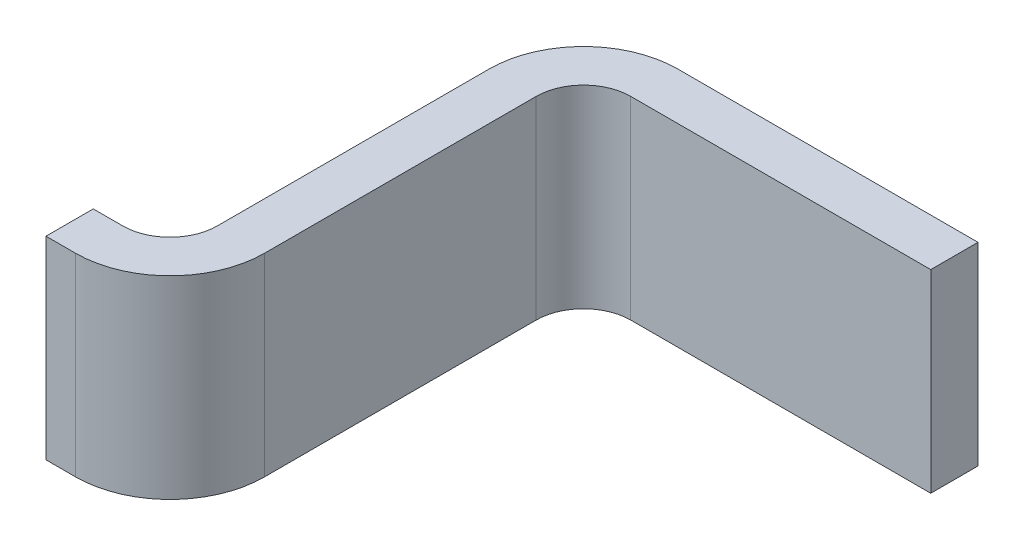
ISO-10303-21;
HEADER;
FILE_DESCRIPTION(('STEP AP214'),'2;1');
FILE_NAME('part.step','',(''),(''),'','','');
FILE_SCHEMA(('AUTOMOTIVE_DESIGN { 1 0 10303 214 1 1 1 1 }'));
ENDSEC;
DATA;
#1=APPLICATION_CONTEXT('core data for automotive mechanical design processes');
#2=APPLICATION_PROTOCOL_DEFINITION('international standard','automotive_design',2000,#1);
#3=PRODUCT_CONTEXT('',#1,'mechanical');
#4=PRODUCT('Part','Part','',(#3));
#5=PRODUCT_RELATED_PRODUCT_CATEGORY('part','',(#4));
#6=PRODUCT_DEFINITION_FORMATION('','',#4);
#7=PRODUCT_DEFINITION_CONTEXT('part definition',#1,'design');
#8=PRODUCT_DEFINITION('design','',#6,#7);
#9=PRODUCT_DEFINITION_SHAPE('','',#8);
#10=(LENGTH_UNIT() NAMED_UNIT(*) SI_UNIT(.MILLI.,.METRE.));
#11=(NAMED_UNIT(*) PLANE_ANGLE_UNIT() SI_UNIT($,.RADIAN.));
#12=(NAMED_UNIT(*) SI_UNIT($,.STERADIAN.) SOLID_ANGLE_UNIT());
#13=UNCERTAINTY_MEASURE_WITH_UNIT(LENGTH_MEASURE(1.E-05),#10,'distance_accuracy_value','');
#14=(GEOMETRIC_REPRESENTATION_CONTEXT(3) GLOBAL_UNCERTAINTY_ASSIGNED_CONTEXT((#13)) GLOBAL_UNIT_ASSIGNED_CONTEXT((#10,
#11,#12)) REPRESENTATION_CONTEXT('',''));
#15=CARTESIAN_POINT('',(0.,0.,0.));
#16=DIRECTION('',(0.,0.,1.));
#17=DIRECTION('',(1.,0.,0.));
#18=AXIS2_PLACEMENT_3D('',#15,#16,#17);
#19=CARTESIAN_POINT('',(0.,0.205,0.975));
#20=DIRECTION('',(0.,0.,-1.));
#21=DIRECTION('',(-1.,0.,0.));
#22=AXIS2_PLACEMENT_3D('',#19,#20,#21);
#23=PLANE('',#22);
#24=DIRECTION('',(1.,0.,0.));
#25=VECTOR('',#24,1.);
#26=CARTESIAN_POINT('',(0.,0.205,0.975));
#27=LINE('',#26,#25);
#28=CARTESIAN_POINT('',(0.0625,0.205,0.975));
#29=VERTEX_POINT('',#28);
#30=CARTESIAN_POINT('',(0.,0.205,0.975));
#31=VERTEX_POINT('',#30);
#32=EDGE_CURVE('E104',#29,#31,#27,.F.);
#33=ORIENTED_EDGE('',*,*,#32,.T.);
#34=DIRECTION('',(0.,1.,0.));
#35=VECTOR('',#34,1.);
#36=CARTESIAN_POINT('',(0.,-0.205,0.975));
#37=LINE('',#36,#35);
#38=CARTESIAN_POINT('',(0.,-0.205,0.975));
#39=VERTEX_POINT('',#38);
#40=EDGE_CURVE('E113',#39,#31,#37,.T.);
#41=ORIENTED_EDGE('',*,*,#40,.F.);
#42=DIRECTION('',(1.,0.,0.));
#43=VECTOR('',#42,1.);
#44=CARTESIAN_POINT('',(0.,-0.205,0.975));
#45=LINE('',#44,#43);
#46=CARTESIAN_POINT('',(0.0625,-0.205,0.975));
#47=VERTEX_POINT('',#46);
#48=EDGE_CURVE('E118',#39,#47,#45,.T.);
#49=ORIENTED_EDGE('',*,*,#48,.T.);
#50=DIRECTION('',(0.,1.,0.));
#51=VECTOR('',#50,1.);
#52=CARTESIAN_POINT('',(0.0625,0.205,0.975));
#53=LINE('',#52,#51);
#54=EDGE_CURVE('E116',#29,#47,#53,.F.);
#55=ORIENTED_EDGE('',*,*,#54,.F.);
#56=EDGE_LOOP('',(#33,#41,#49,#55));
#57=FACE_BOUND('',#56,.T.);
#58=ADVANCED_FACE('F17',(#57),#23,.F.);
#59=CARTESIAN_POINT('',(0.,-0.205,0.875));
#60=DIRECTION('',(-1.,0.,0.));
#61=DIRECTION('',(0.,0.,1.));
#62=AXIS2_PLACEMENT_3D('',#59,#60,#61);
#63=PLANE('',#62);
#64=DIRECTION('',(0.,0.,1.));
#65=VECTOR('',#64,1.);
#66=CARTESIAN_POINT('',(0.,0.205,0.875));
#67=LINE('',#66,#65);
#68=CARTESIAN_POINT('',(0.,0.205,0.875));
#69=VERTEX_POINT('',#68);
#70=EDGE_CURVE('E111',#31,#69,#67,.F.);
#71=ORIENTED_EDGE('',*,*,#70,.T.);
#72=DIRECTION('',(0.,1.,0.));
#73=VECTOR('',#72,1.);
#74=CARTESIAN_POINT('',(0.,-0.205,0.875));
#75=LINE('',#74,#73);
#76=CARTESIAN_POINT('',(0.,-0.205,0.875));
#77=VERTEX_POINT('',#76);
#78=EDGE_CURVE('E127',#69,#77,#75,.F.);
#79=ORIENTED_EDGE('',*,*,#78,.T.);
#80=DIRECTION('',(0.,0.,1.));
#81=VECTOR('',#80,1.);
#82=CARTESIAN_POINT('',(0.,-0.205,0.975));
#83=LINE('',#82,#81);
#84=EDGE_CURVE('E140',#77,#39,#83,.T.);
#85=ORIENTED_EDGE('',*,*,#84,.T.);
#86=ORIENTED_EDGE('',*,*,#40,.T.);
#87=EDGE_LOOP('',(#71,#79,#85,#86));
#88=FACE_BOUND('',#87,.T.);
#89=ADVANCED_FACE('F277',(#88),#63,.T.);
#90=CARTESIAN_POINT('',(0.0625,0.205,0.775));
#91=DIRECTION('',(0.,1.,0.));
#92=DIRECTION('',(0.,0.,1.));
#93=AXIS2_PLACEMENT_3D('',#90,#91,#92);
#94=CYLINDRICAL_SURFACE('',#93,0.2);
#95=CARTESIAN_POINT('',(0.0625,0.205,0.775));
#96=DIRECTION('',(0.,1.,0.));
#97=DIRECTION('',(0.,0.,1.));
#98=AXIS2_PLACEMENT_3D('',#95,#96,#97);
#99=CIRCLE('',#98,0.2);
#100=CARTESIAN_POINT('',(0.2625,0.205,0.775));
#101=VERTEX_POINT('',#100);
#102=EDGE_CURVE('E20',#29,#101,#99,.T.);
#103=ORIENTED_EDGE('',*,*,#102,.F.);
#104=ORIENTED_EDGE('',*,*,#54,.T.);
#105=CARTESIAN_POINT('',(0.0625,-0.205,0.775));
#106=DIRECTION('',(0.,1.,0.));
#107=DIRECTION('',(0.,0.,1.));
#108=AXIS2_PLACEMENT_3D('',#105,#106,#107);
#109=CIRCLE('',#108,0.2);
#110=CARTESIAN_POINT('',(0.2625,-0.205,0.775));
#111=VERTEX_POINT('',#110);
#112=EDGE_CURVE('E178',#111,#47,#109,.F.);
#113=ORIENTED_EDGE('',*,*,#112,.F.);
#114=DIRECTION('',(0.,1.,0.));
#115=VECTOR('',#114,1.);
#116=CARTESIAN_POINT('',(0.2625,0.205,0.775));
#117=LINE('',#116,#115);
#118=EDGE_CURVE('E124',#111,#101,#117,.T.);
#119=ORIENTED_EDGE('',*,*,#118,.T.);
#120=EDGE_LOOP('',(#103,#104,#113,#119));
#121=FACE_BOUND('',#120,.T.);
#122=ADVANCED_FACE('F123',(#121),#94,.T.);
#123=CARTESIAN_POINT('',(0.,-0.205,0.875));
#124=DIRECTION('',(0.,0.,1.));
#125=DIRECTION('',(1.,0.,0.));
#126=AXIS2_PLACEMENT_3D('',#123,#124,#125);
#127=PLANE('',#126);
#128=DIRECTION('',(1.,0.,0.));
#129=VECTOR('',#128,1.);
#130=CARTESIAN_POINT('',(0.,-0.205,0.875));
#131=LINE('',#130,#129);
#132=CARTESIAN_POINT('',(0.0625,-0.205,0.875));
#133=VERTEX_POINT('',#132);
#134=EDGE_CURVE('E131',#77,#133,#131,.T.);
#135=ORIENTED_EDGE('',*,*,#134,.F.);
#136=ORIENTED_EDGE('',*,*,#78,.F.);
#137=DIRECTION('',(1.,0.,0.));
#138=VECTOR('',#137,1.);
#139=CARTESIAN_POINT('',(0.,0.205,0.875));
#140=LINE('',#139,#138);
#141=CARTESIAN_POINT('',(0.0625,0.205,0.875));
#142=VERTEX_POINT('',#141);
#143=EDGE_CURVE('E126',#142,#69,#140,.F.);
#144=ORIENTED_EDGE('',*,*,#143,.F.);
#145=DIRECTION('',(0.,1.,0.));
#146=VECTOR('',#145,1.);
#147=CARTESIAN_POINT('',(0.0625,-0.205,0.875));
#148=LINE('',#147,#146);
#149=EDGE_CURVE('E175',#142,#133,#148,.F.);
#150=ORIENTED_EDGE('',*,*,#149,.T.);
#151=EDGE_LOOP('',(#135,#136,#144,#150));
#152=FACE_BOUND('',#151,.T.);
#153=ADVANCED_FACE('F271',(#152),#127,.F.);
#154=CARTESIAN_POINT('',(0.2625,0.205,0.775));
#155=DIRECTION('',(-1.,0.,0.));
#156=DIRECTION('',(0.,0.,1.));
#157=AXIS2_PLACEMENT_3D('',#154,#155,#156);
#158=PLANE('',#157);
#159=DIRECTION('',(0.,0.,-1.));
#160=VECTOR('',#159,1.);
#161=CARTESIAN_POINT('',(0.2625,0.205,0.775));
#162=LINE('',#161,#160);
#163=CARTESIAN_POINT('',(0.2625,0.205,0.2));
#164=VERTEX_POINT('',#163);
#165=EDGE_CURVE('E177',#164,#101,#162,.F.);
#166=ORIENTED_EDGE('',*,*,#165,.T.);
#167=ORIENTED_EDGE('',*,*,#118,.F.);
#168=DIRECTION('',(0.,0.,1.));
#169=VECTOR('',#168,1.);
#170=CARTESIAN_POINT('',(0.2625,-0.205,0.775));
#171=LINE('',#170,#169);
#172=CARTESIAN_POINT('',(0.2625,-0.205,0.2));
#173=VERTEX_POINT('',#172);
#174=EDGE_CURVE('E174',#111,#173,#171,.F.);
#175=ORIENTED_EDGE('',*,*,#174,.T.);
#176=DIRECTION('',(0.,-1.,0.));
#177=VECTOR('',#176,1.);
#178=CARTESIAN_POINT('',(0.2625,0.205,0.2));
#179=LINE('',#178,#177);
#180=EDGE_CURVE('E171',#173,#164,#179,.F.);
#181=ORIENTED_EDGE('',*,*,#180,.T.);
#182=EDGE_LOOP('',(#166,#167,#175,#181));
#183=FACE_BOUND('',#182,.T.);
#184=ADVANCED_FACE('F267',(#183),#158,.F.);
#185=CARTESIAN_POINT('',(0.0625,-0.205,0.775));
#186=DIRECTION('',(0.,1.,0.));
#187=DIRECTION('',(0.,0.,1.));
#188=AXIS2_PLACEMENT_3D('',#185,#186,#187);
#189=CYLINDRICAL_SURFACE('',#188,0.1);
#190=CARTESIAN_POINT('',(0.0625,-0.205,0.775));
#191=DIRECTION('',(0.,1.,0.));
#192=DIRECTION('',(0.,0.,1.));
#193=AXIS2_PLACEMENT_3D('',#190,#191,#192);
#194=CIRCLE('',#193,0.1);
#195=CARTESIAN_POINT('',(0.1625,-0.205,0.775));
#196=VERTEX_POINT('',#195);
#197=EDGE_CURVE('E172',#133,#196,#194,.T.);
#198=ORIENTED_EDGE('',*,*,#197,.F.);
#199=ORIENTED_EDGE('',*,*,#149,.F.);
#200=CARTESIAN_POINT('',(0.0625,0.205,0.775));
#201=DIRECTION('',(0.,1.,0.));
#202=DIRECTION('',(0.,0.,1.));
#203=AXIS2_PLACEMENT_3D('',#200,#201,#202);
#204=CIRCLE('',#203,0.1);
#205=CARTESIAN_POINT('',(0.1625,0.205,0.775));
#206=VERTEX_POINT('',#205);
#207=EDGE_CURVE('E176',#206,#142,#204,.F.);
#208=ORIENTED_EDGE('',*,*,#207,.F.);
#209=DIRECTION('',(0.,1.,0.));
#210=VECTOR('',#209,1.);
#211=CARTESIAN_POINT('',(0.1625,-0.205,0.775));
#212=LINE('',#211,#210);
#213=EDGE_CURVE('E188',#206,#196,#212,.F.);
#214=ORIENTED_EDGE('',*,*,#213,.T.);
#215=EDGE_LOOP('',(#198,#199,#208,#214));
#216=FACE_BOUND('',#215,.T.);
#217=ADVANCED_FACE('F263',(#216),#189,.F.);
#218=CARTESIAN_POINT('',(0.3625,0.205,0.2));
#219=DIRECTION('',(0.,-1.,0.));
#220=DIRECTION('',(0.,0.,-1.));
#221=AXIS2_PLACEMENT_3D('',#218,#219,#220);
#222=CYLINDRICAL_SURFACE('',#221,0.1);
#223=CARTESIAN_POINT('',(0.3625,0.205,0.2));
#224=DIRECTION('',(0.,-1.,0.));
#225=DIRECTION('',(0.,0.,-1.));
#226=AXIS2_PLACEMENT_3D('',#223,#224,#225);
#227=CIRCLE('',#226,0.1);
#228=CARTESIAN_POINT('',(0.3625,0.205,0.1));
#229=VERTEX_POINT('',#228);
#230=EDGE_CURVE('E168',#164,#229,#227,.T.);
#231=ORIENTED_EDGE('',*,*,#230,.F.);
#232=ORIENTED_EDGE('',*,*,#180,.F.);
#233=CARTESIAN_POINT('',(0.3625,-0.205,0.2));
#234=DIRECTION('',(0.,-1.,0.));
#235=DIRECTION('',(0.,0.,-1.));
#236=AXIS2_PLACEMENT_3D('',#233,#234,#235);
#237=CIRCLE('',#236,0.1);
#238=CARTESIAN_POINT('',(0.3625,-0.205,0.1));
#239=VERTEX_POINT('',#238);
#240=EDGE_CURVE('E163',#239,#173,#237,.F.);
#241=ORIENTED_EDGE('',*,*,#240,.F.);
#242=DIRECTION('',(0.,1.,0.));
#243=VECTOR('',#242,1.);
#244=CARTESIAN_POINT('',(0.3625,0.205,0.1));
#245=LINE('',#244,#243);
#246=EDGE_CURVE('E166',#239,#229,#245,.T.);
#247=ORIENTED_EDGE('',*,*,#246,.T.);
#248=EDGE_LOOP('',(#231,#232,#241,#247));
#249=FACE_BOUND('',#248,.T.);
#250=ADVANCED_FACE('F259',(#249),#222,.F.);
#251=CARTESIAN_POINT('',(0.1625,-0.205,0.775));
#252=DIRECTION('',(1.,0.,0.));
#253=DIRECTION('',(0.,0.,-1.));
#254=AXIS2_PLACEMENT_3D('',#251,#252,#253);
#255=PLANE('',#254);
#256=DIRECTION('',(0.,0.,-1.));
#257=VECTOR('',#256,1.);
#258=CARTESIAN_POINT('',(0.1625,-0.205,0.775));
#259=LINE('',#258,#257);
#260=CARTESIAN_POINT('',(0.1625,-0.205,0.2));
#261=VERTEX_POINT('',#260);
#262=EDGE_CURVE('E167',#196,#261,#259,.T.);
#263=ORIENTED_EDGE('',*,*,#262,.F.);
#264=ORIENTED_EDGE('',*,*,#213,.F.);
#265=DIRECTION('',(0.,0.,-1.));
#266=VECTOR('',#265,1.);
#267=CARTESIAN_POINT('',(0.1625,0.205,0.775));
#268=LINE('',#267,#266);
#269=CARTESIAN_POINT('',(0.1625,0.205,0.2));
#270=VERTEX_POINT('',#269);
#271=EDGE_CURVE('E170',#270,#206,#268,.F.);
#272=ORIENTED_EDGE('',*,*,#271,.F.);
#273=DIRECTION('',(0.,-1.,0.));
#274=VECTOR('',#273,1.);
#275=CARTESIAN_POINT('',(0.1625,-0.205,0.2));
#276=LINE('',#275,#274);
#277=EDGE_CURVE('E159',#261,#270,#276,.F.);
#278=ORIENTED_EDGE('',*,*,#277,.F.);
#279=EDGE_LOOP('',(#263,#264,#272,#278));
#280=FACE_BOUND('',#279,.T.);
#281=ADVANCED_FACE('F255',(#280),#255,.F.);
#282=CARTESIAN_POINT('',(0.3625,0.205,0.1));
#283=DIRECTION('',(0.,0.,-1.));
#284=DIRECTION('',(-1.,0.,0.));
#285=AXIS2_PLACEMENT_3D('',#282,#283,#284);
#286=PLANE('',#285);
#287=DIRECTION('',(1.,0.,0.));
#288=VECTOR('',#287,1.);
#289=CARTESIAN_POINT('',(0.3625,0.205,0.1));
#290=LINE('',#289,#288);
#291=CARTESIAN_POINT('',(0.9975,0.205,0.1));
#292=VERTEX_POINT('',#291);
#293=EDGE_CURVE('E162',#292,#229,#290,.F.);
#294=ORIENTED_EDGE('',*,*,#293,.T.);
#295=ORIENTED_EDGE('',*,*,#246,.F.);
#296=DIRECTION('',(1.,0.,0.));
#297=VECTOR('',#296,1.);
#298=CARTESIAN_POINT('',(0.3625,-0.205,0.1));
#299=LINE('',#298,#297);
#300=CARTESIAN_POINT('',(0.9975,-0.205,0.1));
#301=VERTEX_POINT('',#300);
#302=EDGE_CURVE('E216',#239,#301,#299,.T.);
#303=ORIENTED_EDGE('',*,*,#302,.T.);
#304=DIRECTION('',(0.,1.,0.));
#305=VECTOR('',#304,1.);
#306=CARTESIAN_POINT('',(0.9975,-0.205,0.1));
#307=LINE('',#306,#305);
#308=EDGE_CURVE('E197',#301,#292,#307,.T.);
#309=ORIENTED_EDGE('',*,*,#308,.T.);
#310=EDGE_LOOP('',(#294,#295,#303,#309));
#311=FACE_BOUND('',#310,.T.);
#312=ADVANCED_FACE('F252',(#311),#286,.F.);
#313=CARTESIAN_POINT('',(0.3625,0.205,0.));
#314=DIRECTION('',(0.,-1.,0.));
#315=DIRECTION('',(0.,0.,-1.));
#316=AXIS2_PLACEMENT_3D('',#313,#314,#315);
#317=PLANE('',#316);
#318=DIRECTION('',(1.,0.,0.));
#319=VECTOR('',#318,1.);
#320=CARTESIAN_POINT('',(0.3625,0.205,0.));
#321=LINE('',#320,#319);
#322=CARTESIAN_POINT('',(0.9975,0.205,0.));
#323=VERTEX_POINT('',#322);
#324=CARTESIAN_POINT('',(0.3625,0.205,0.));
#325=VERTEX_POINT('',#324);
#326=EDGE_CURVE('E205',#323,#325,#321,.F.);
#327=ORIENTED_EDGE('',*,*,#326,.T.);
#328=CARTESIAN_POINT('',(0.3625,0.205,0.2));
#329=DIRECTION('',(0.,-1.,0.));
#330=DIRECTION('',(0.,0.,-1.));
#331=AXIS2_PLACEMENT_3D('',#328,#329,#330);
#332=CIRCLE('',#331,0.2);
#333=EDGE_CURVE('E160',#270,#325,#332,.T.);
#334=ORIENTED_EDGE('',*,*,#333,.F.);
#335=ORIENTED_EDGE('',*,*,#271,.T.);
#336=ORIENTED_EDGE('',*,*,#207,.T.);
#337=ORIENTED_EDGE('',*,*,#143,.T.);
#338=ORIENTED_EDGE('',*,*,#70,.F.);
#339=ORIENTED_EDGE('',*,*,#32,.F.);
#340=ORIENTED_EDGE('',*,*,#102,.T.);
#341=ORIENTED_EDGE('',*,*,#165,.F.);
#342=ORIENTED_EDGE('',*,*,#230,.T.);
#343=ORIENTED_EDGE('',*,*,#293,.F.);
#344=DIRECTION('',(0.,0.,1.));
#345=VECTOR('',#344,1.);
#346=CARTESIAN_POINT('',(0.9975,0.205,0.));
#347=LINE('',#346,#345);
#348=EDGE_CURVE('E200',#292,#323,#347,.F.);
#349=ORIENTED_EDGE('',*,*,#348,.T.);
#350=EDGE_LOOP('',(#327,#334,#335,#336,#337,#338,#339,#340,#341,#342,#343,#349));
#351=FACE_BOUND('',#350,.T.);
#352=ADVANCED_FACE('F107',(#351),#317,.F.);
#353=CARTESIAN_POINT('',(0.3625,-0.205,0.2));
#354=DIRECTION('',(0.,-1.,0.));
#355=DIRECTION('',(0.,0.,-1.));
#356=AXIS2_PLACEMENT_3D('',#353,#354,#355);
#357=CYLINDRICAL_SURFACE('',#356,0.2);
#358=CARTESIAN_POINT('',(0.3625,-0.205,0.2));
#359=DIRECTION('',(0.,-1.,0.));
#360=DIRECTION('',(0.,0.,-1.));
#361=AXIS2_PLACEMENT_3D('',#358,#359,#360);
#362=CIRCLE('',#361,0.2);
#363=CARTESIAN_POINT('',(0.3625,-0.205,0.));
#364=VERTEX_POINT('',#363);
#365=EDGE_CURVE('E157',#364,#261,#362,.F.);
#366=ORIENTED_EDGE('',*,*,#365,.T.);
#367=ORIENTED_EDGE('',*,*,#277,.T.);
#368=ORIENTED_EDGE('',*,*,#333,.T.);
#369=DIRECTION('',(0.,1.,0.));
#370=VECTOR('',#369,1.);
#371=CARTESIAN_POINT('',(0.3625,-0.205,0.));
#372=LINE('',#371,#370);
#373=EDGE_CURVE('E211',#325,#364,#372,.F.);
#374=ORIENTED_EDGE('',*,*,#373,.T.);
#375=EDGE_LOOP('',(#366,#367,#368,#374));
#376=FACE_BOUND('',#375,.T.);
#377=ADVANCED_FACE('F233',(#376),#357,.T.);
#378=CARTESIAN_POINT('',(0.3625,-0.205,0.1));
#379=DIRECTION('',(0.,1.,0.));
#380=DIRECTION('',(0.,0.,1.));
#381=AXIS2_PLACEMENT_3D('',#378,#379,#380);
#382=PLANE('',#381);
#383=ORIENTED_EDGE('',*,*,#302,.F.);
#384=ORIENTED_EDGE('',*,*,#240,.T.);
#385=ORIENTED_EDGE('',*,*,#174,.F.);
#386=ORIENTED_EDGE('',*,*,#112,.T.);
#387=ORIENTED_EDGE('',*,*,#48,.F.);
#388=ORIENTED_EDGE('',*,*,#84,.F.);
#389=ORIENTED_EDGE('',*,*,#134,.T.);
#390=ORIENTED_EDGE('',*,*,#197,.T.);
#391=ORIENTED_EDGE('',*,*,#262,.T.);
#392=ORIENTED_EDGE('',*,*,#365,.F.);
#393=DIRECTION('',(1.,0.,0.));
#394=VECTOR('',#393,1.);
#395=CARTESIAN_POINT('',(0.3625,-0.205,0.));
#396=LINE('',#395,#394);
#397=CARTESIAN_POINT('',(0.9975,-0.205,0.));
#398=VERTEX_POINT('',#397);
#399=EDGE_CURVE('E26',#364,#398,#396,.T.);
#400=ORIENTED_EDGE('',*,*,#399,.T.);
#401=DIRECTION('',(0.,0.,1.));
#402=VECTOR('',#401,1.);
#403=CARTESIAN_POINT('',(0.9975,-0.205,0.));
#404=LINE('',#403,#402);
#405=EDGE_CURVE('E34',#398,#301,#404,.T.);
#406=ORIENTED_EDGE('',*,*,#405,.T.);
#407=EDGE_LOOP('',(#383,#384,#385,#386,#387,#388,#389,#390,#391,#392,#400,#406));
#408=FACE_BOUND('',#407,.T.);
#409=ADVANCED_FACE('F227',(#408),#382,.F.);
#410=CARTESIAN_POINT('',(0.9975,-0.205,0.));
#411=DIRECTION('',(-1.,0.,0.));
#412=DIRECTION('',(0.,0.,1.));
#413=AXIS2_PLACEMENT_3D('',#410,#411,#412);
#414=PLANE('',#413);
#415=ORIENTED_EDGE('',*,*,#348,.F.);
#416=ORIENTED_EDGE('',*,*,#308,.F.);
#417=ORIENTED_EDGE('',*,*,#405,.F.);
#418=DIRECTION('',(0.,1.,0.));
#419=VECTOR('',#418,1.);
#420=CARTESIAN_POINT('',(0.9975,-0.205,0.));
#421=LINE('',#420,#419);
#422=EDGE_CURVE('E11',#398,#323,#421,.T.);
#423=ORIENTED_EDGE('',*,*,#422,.T.);
#424=EDGE_LOOP('',(#415,#416,#417,#423));
#425=FACE_BOUND('',#424,.T.);
#426=ADVANCED_FACE('F237',(#425),#414,.F.);
#427=CARTESIAN_POINT('',(0.3625,-0.205,0.));
#428=DIRECTION('',(0.,0.,1.));
#429=DIRECTION('',(1.,0.,0.));
#430=AXIS2_PLACEMENT_3D('',#427,#428,#429);
#431=PLANE('',#430);
#432=ORIENTED_EDGE('',*,*,#399,.F.);
#433=ORIENTED_EDGE('',*,*,#373,.F.);
#434=ORIENTED_EDGE('',*,*,#326,.F.);
#435=ORIENTED_EDGE('',*,*,#422,.F.);
#436=EDGE_LOOP('',(#432,#433,#434,#435));
#437=FACE_BOUND('',#436,.T.);
#438=ADVANCED_FACE('F231',(#437),#431,.F.);
#439=CLOSED_SHELL('',(#58,#89,#122,#153,#184,#217,#250,#281,#312,#352,#377,#409,#426,#438));
#440=MANIFOLD_SOLID_BREP('B1',#439);
#441=ADVANCED_BREP_SHAPE_REPRESENTATION('',(#18,#440),#14);
#442=SHAPE_DEFINITION_REPRESENTATION(#9,#441);
ENDSEC;
END-ISO-10303-21;
